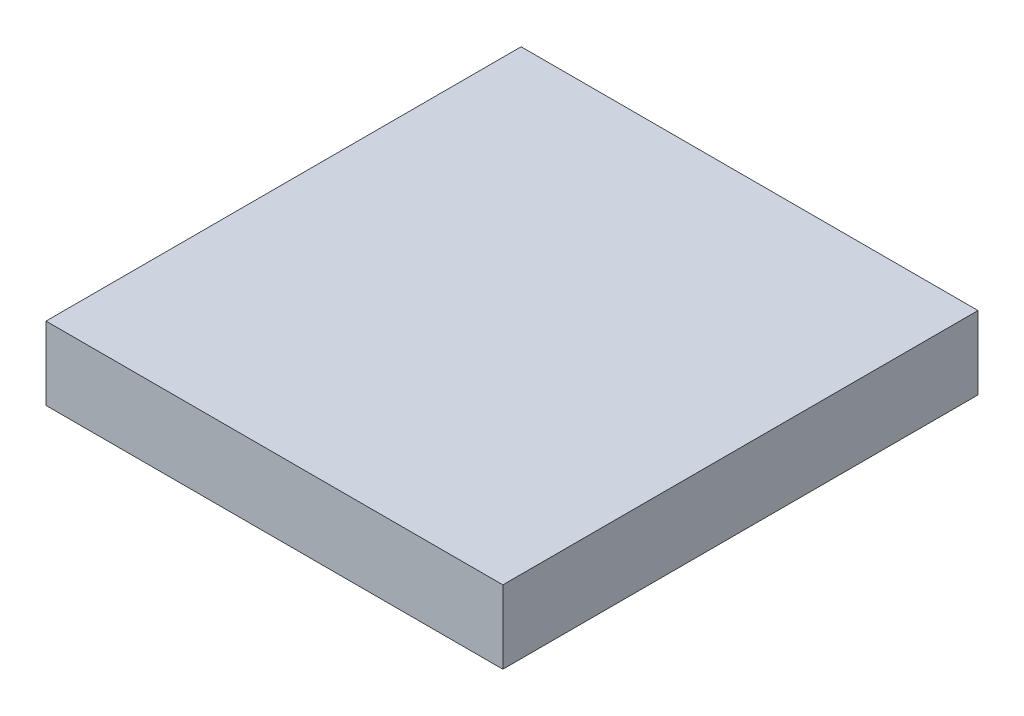
ISO-10303-21;
HEADER;
FILE_DESCRIPTION(('STEP AP214'),'2;1');
FILE_NAME('part.step','',(''),(''),'','','');
FILE_SCHEMA(('AUTOMOTIVE_DESIGN { 1 0 10303 214 1 1 1 1 }'));
ENDSEC;
DATA;
#1=APPLICATION_CONTEXT('core data for automotive mechanical design processes');
#2=APPLICATION_PROTOCOL_DEFINITION('international standard','automotive_design',2000,#1);
#3=PRODUCT_CONTEXT('',#1,'mechanical');
#4=PRODUCT('Part','Part','',(#3));
#5=PRODUCT_RELATED_PRODUCT_CATEGORY('part','',(#4));
#6=PRODUCT_DEFINITION_FORMATION('','',#4);
#7=PRODUCT_DEFINITION_CONTEXT('part definition',#1,'design');
#8=PRODUCT_DEFINITION('design','',#6,#7);
#9=PRODUCT_DEFINITION_SHAPE('','',#8);
#10=(LENGTH_UNIT() NAMED_UNIT(*) SI_UNIT(.MILLI.,.METRE.));
#11=(NAMED_UNIT(*) PLANE_ANGLE_UNIT() SI_UNIT($,.RADIAN.));
#12=(NAMED_UNIT(*) SI_UNIT($,.STERADIAN.) SOLID_ANGLE_UNIT());
#13=UNCERTAINTY_MEASURE_WITH_UNIT(LENGTH_MEASURE(1.E-05),#10,'distance_accuracy_value','');
#14=(GEOMETRIC_REPRESENTATION_CONTEXT(3) GLOBAL_UNCERTAINTY_ASSIGNED_CONTEXT((#13)) GLOBAL_UNIT_ASSIGNED_CONTEXT((#10,
#11,#12)) REPRESENTATION_CONTEXT('',''));
#15=CARTESIAN_POINT('',(0.,0.,0.));
#16=DIRECTION('',(0.,0.,1.));
#17=DIRECTION('',(1.,0.,0.));
#18=AXIS2_PLACEMENT_3D('',#15,#16,#17);
#19=CARTESIAN_POINT('',(-250.,-80.,0.));
#20=DIRECTION('',(-1.,0.,0.));
#21=DIRECTION('',(0.,0.,1.));
#22=AXIS2_PLACEMENT_3D('',#19,#20,#21);
#23=PLANE('',#22);
#24=DIRECTION('',(0.,0.,1.));
#25=VECTOR('',#24,1.);
#26=CARTESIAN_POINT('',(-250.,0.,0.));
#27=LINE('',#26,#25);
#28=CARTESIAN_POINT('',(-250.,0.,-520.));
#29=VERTEX_POINT('',#28);
#30=CARTESIAN_POINT('',(-250.,0.,0.));
#31=VERTEX_POINT('',#30);
#32=EDGE_CURVE('E100',#29,#31,#27,.T.);
#33=ORIENTED_EDGE('',*,*,#32,.F.);
#34=DIRECTION('',(0.,1.,0.));
#35=VECTOR('',#34,1.);
#36=CARTESIAN_POINT('',(-250.,-80.,-520.));
#37=LINE('',#36,#35);
#38=CARTESIAN_POINT('',(-250.,-80.,-520.));
#39=VERTEX_POINT('',#38);
#40=EDGE_CURVE('E11',#39,#29,#37,.T.);
#41=ORIENTED_EDGE('',*,*,#40,.F.);
#42=DIRECTION('',(0.,0.,1.));
#43=VECTOR('',#42,1.);
#44=CARTESIAN_POINT('',(-250.,-80.,0.));
#45=LINE('',#44,#43);
#46=CARTESIAN_POINT('',(-250.,-80.,0.));
#47=VERTEX_POINT('',#46);
#48=EDGE_CURVE('E94',#39,#47,#45,.T.);
#49=ORIENTED_EDGE('',*,*,#48,.T.);
#50=DIRECTION('',(0.,1.,0.));
#51=VECTOR('',#50,1.);
#52=CARTESIAN_POINT('',(-250.,-80.,0.));
#53=LINE('',#52,#51);
#54=EDGE_CURVE('E39',#47,#31,#53,.T.);
#55=ORIENTED_EDGE('',*,*,#54,.T.);
#56=EDGE_LOOP('',(#33,#41,#49,#55));
#57=FACE_BOUND('',#56,.T.);
#58=ADVANCED_FACE('F36',(#57),#23,.T.);
#59=CARTESIAN_POINT('',(-250.,-80.,-520.));
#60=DIRECTION('',(0.,0.,-1.));
#61=DIRECTION('',(-1.,0.,0.));
#62=AXIS2_PLACEMENT_3D('',#59,#60,#61);
#63=PLANE('',#62);
#64=DIRECTION('',(-1.,0.,0.));
#65=VECTOR('',#64,1.);
#66=CARTESIAN_POINT('',(-250.,0.,-520.));
#67=LINE('',#66,#65);
#68=CARTESIAN_POINT('',(250.,0.,-520.));
#69=VERTEX_POINT('',#68);
#70=EDGE_CURVE('E96',#69,#29,#67,.T.);
#71=ORIENTED_EDGE('',*,*,#70,.F.);
#72=DIRECTION('',(0.,1.,0.));
#73=VECTOR('',#72,1.);
#74=CARTESIAN_POINT('',(250.,-80.,-520.));
#75=LINE('',#74,#73);
#76=CARTESIAN_POINT('',(250.,-80.,-520.));
#77=VERTEX_POINT('',#76);
#78=EDGE_CURVE('E45',#77,#69,#75,.T.);
#79=ORIENTED_EDGE('',*,*,#78,.F.);
#80=DIRECTION('',(-1.,0.,0.));
#81=VECTOR('',#80,1.);
#82=CARTESIAN_POINT('',(-250.,-80.,-520.));
#83=LINE('',#82,#81);
#84=EDGE_CURVE('E91',#77,#39,#83,.T.);
#85=ORIENTED_EDGE('',*,*,#84,.T.);
#86=ORIENTED_EDGE('',*,*,#40,.T.);
#87=EDGE_LOOP('',(#71,#79,#85,#86));
#88=FACE_BOUND('',#87,.T.);
#89=ADVANCED_FACE('F110',(#88),#63,.T.);
#90=CARTESIAN_POINT('',(250.,-80.,0.));
#91=DIRECTION('',(1.,0.,0.));
#92=DIRECTION('',(0.,0.,-1.));
#93=AXIS2_PLACEMENT_3D('',#90,#91,#92);
#94=PLANE('',#93);
#95=DIRECTION('',(0.,0.,-1.));
#96=VECTOR('',#95,1.);
#97=CARTESIAN_POINT('',(250.,0.,0.));
#98=LINE('',#97,#96);
#99=CARTESIAN_POINT('',(250.,0.,0.));
#100=VERTEX_POINT('',#99);
#101=EDGE_CURVE('E86',#100,#69,#98,.T.);
#102=ORIENTED_EDGE('',*,*,#101,.F.);
#103=DIRECTION('',(0.,1.,0.));
#104=VECTOR('',#103,1.);
#105=CARTESIAN_POINT('',(250.,-80.,0.));
#106=LINE('',#105,#104);
#107=CARTESIAN_POINT('',(250.,-80.,0.));
#108=VERTEX_POINT('',#107);
#109=EDGE_CURVE('E81',#108,#100,#106,.T.);
#110=ORIENTED_EDGE('',*,*,#109,.F.);
#111=DIRECTION('',(0.,0.,-1.));
#112=VECTOR('',#111,1.);
#113=CARTESIAN_POINT('',(250.,-80.,0.));
#114=LINE('',#113,#112);
#115=EDGE_CURVE('E84',#108,#77,#114,.T.);
#116=ORIENTED_EDGE('',*,*,#115,.T.);
#117=ORIENTED_EDGE('',*,*,#78,.T.);
#118=EDGE_LOOP('',(#102,#110,#116,#117));
#119=FACE_BOUND('',#118,.T.);
#120=ADVANCED_FACE('F83',(#119),#94,.T.);
#121=CARTESIAN_POINT('',(-250.,-80.,0.));
#122=DIRECTION('',(0.,0.,1.));
#123=DIRECTION('',(1.,0.,0.));
#124=AXIS2_PLACEMENT_3D('',#121,#122,#123);
#125=PLANE('',#124);
#126=DIRECTION('',(1.,0.,0.));
#127=VECTOR('',#126,1.);
#128=CARTESIAN_POINT('',(-250.,0.,0.));
#129=LINE('',#128,#127);
#130=EDGE_CURVE('E103',#31,#100,#129,.T.);
#131=ORIENTED_EDGE('',*,*,#130,.F.);
#132=ORIENTED_EDGE('',*,*,#54,.F.);
#133=DIRECTION('',(1.,0.,0.));
#134=VECTOR('',#133,1.);
#135=CARTESIAN_POINT('',(-250.,-80.,0.));
#136=LINE('',#135,#134);
#137=EDGE_CURVE('E90',#47,#108,#136,.T.);
#138=ORIENTED_EDGE('',*,*,#137,.T.);
#139=ORIENTED_EDGE('',*,*,#109,.T.);
#140=EDGE_LOOP('',(#131,#132,#138,#139));
#141=FACE_BOUND('',#140,.T.);
#142=ADVANCED_FACE('F93',(#141),#125,.T.);
#143=CARTESIAN_POINT('',(0.,-80.,0.));
#144=DIRECTION('',(0.,-1.,0.));
#145=DIRECTION('',(0.,0.,-1.));
#146=AXIS2_PLACEMENT_3D('',#143,#144,#145);
#147=PLANE('',#146);
#148=ORIENTED_EDGE('',*,*,#48,.F.);
#149=ORIENTED_EDGE('',*,*,#84,.F.);
#150=ORIENTED_EDGE('',*,*,#115,.F.);
#151=ORIENTED_EDGE('',*,*,#137,.F.);
#152=EDGE_LOOP('',(#148,#149,#150,#151));
#153=FACE_BOUND('',#152,.T.);
#154=ADVANCED_FACE('F89',(#153),#147,.T.);
#155=CARTESIAN_POINT('',(0.,0.,0.));
#156=DIRECTION('',(0.,-1.,0.));
#157=DIRECTION('',(0.,0.,-1.));
#158=AXIS2_PLACEMENT_3D('',#155,#156,#157);
#159=PLANE('',#158);
#160=ORIENTED_EDGE('',*,*,#32,.T.);
#161=ORIENTED_EDGE('',*,*,#130,.T.);
#162=ORIENTED_EDGE('',*,*,#101,.T.);
#163=ORIENTED_EDGE('',*,*,#70,.T.);
#164=EDGE_LOOP('',(#160,#161,#162,#163));
#165=FACE_BOUND('',#164,.T.);
#166=ADVANCED_FACE('F109',(#165),#159,.F.);
#167=CLOSED_SHELL('',(#58,#89,#120,#142,#154,#166));
#168=MANIFOLD_SOLID_BREP('B2',#167);
#169=ADVANCED_BREP_SHAPE_REPRESENTATION('',(#18,#168),#14);
#170=SHAPE_DEFINITION_REPRESENTATION(#9,#169);
ENDSEC;
END-ISO-10303-21;
